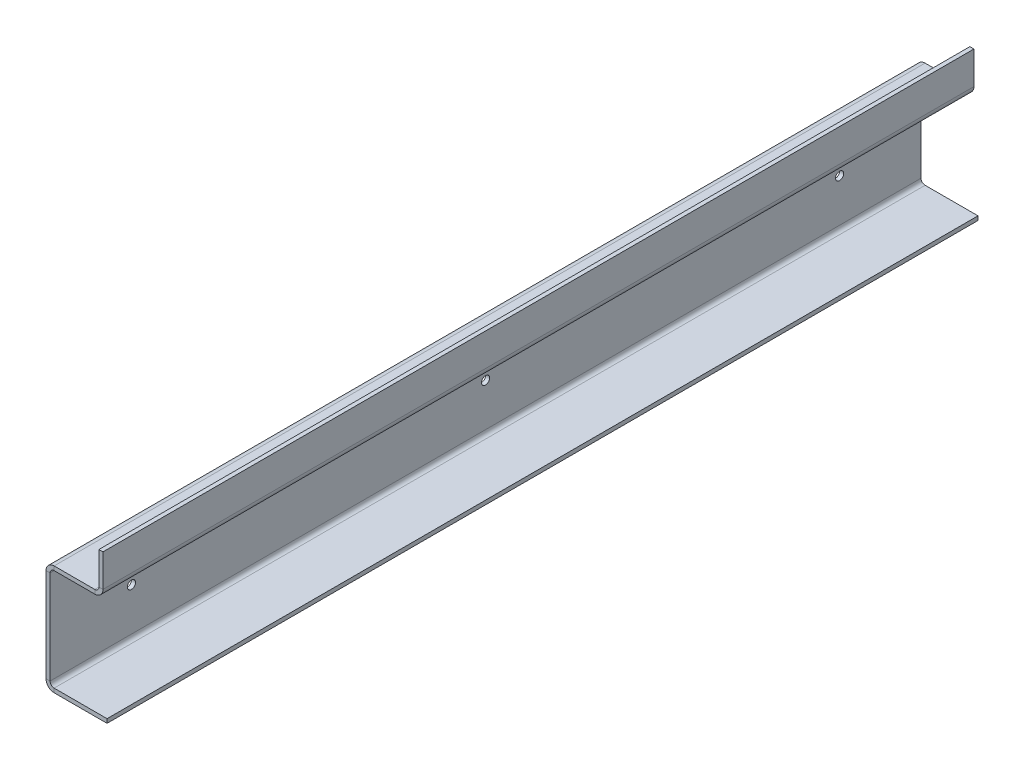
ISO-10303-21;
HEADER;
FILE_DESCRIPTION(('STEP AP214'),'2;1');
FILE_NAME('part.step','',(''),(''),'','','');
FILE_SCHEMA(('AUTOMOTIVE_DESIGN { 1 0 10303 214 1 1 1 1 }'));
ENDSEC;
DATA;
#1=APPLICATION_CONTEXT('core data for automotive mechanical design processes');
#2=APPLICATION_PROTOCOL_DEFINITION('international standard','automotive_design',2000,#1);
#3=PRODUCT_CONTEXT('',#1,'mechanical');
#4=PRODUCT('Part','Part','',(#3));
#5=PRODUCT_RELATED_PRODUCT_CATEGORY('part','',(#4));
#6=PRODUCT_DEFINITION_FORMATION('','',#4);
#7=PRODUCT_DEFINITION_CONTEXT('part definition',#1,'design');
#8=PRODUCT_DEFINITION('design','',#6,#7);
#9=PRODUCT_DEFINITION_SHAPE('','',#8);
#10=(LENGTH_UNIT() NAMED_UNIT(*) SI_UNIT(.MILLI.,.METRE.));
#11=(NAMED_UNIT(*) PLANE_ANGLE_UNIT() SI_UNIT($,.RADIAN.));
#12=(NAMED_UNIT(*) SI_UNIT($,.STERADIAN.) SOLID_ANGLE_UNIT());
#13=UNCERTAINTY_MEASURE_WITH_UNIT(LENGTH_MEASURE(1.E-05),#10,'distance_accuracy_value','');
#14=(GEOMETRIC_REPRESENTATION_CONTEXT(3) GLOBAL_UNCERTAINTY_ASSIGNED_CONTEXT((#13)) GLOBAL_UNIT_ASSIGNED_CONTEXT((#10,
#11,#12)) REPRESENTATION_CONTEXT('',''));
#15=CARTESIAN_POINT('',(0.,0.,0.));
#16=DIRECTION('',(0.,0.,1.));
#17=DIRECTION('',(1.,0.,0.));
#18=AXIS2_PLACEMENT_3D('',#15,#16,#17);
#19=CARTESIAN_POINT('',(-38.,25.,174.));
#20=DIRECTION('',(1.,0.,0.));
#21=DIRECTION('',(0.,0.,-1.));
#22=AXIS2_PLACEMENT_3D('',#19,#20,#21);
#23=CYLINDRICAL_SURFACE('',#22,2.);
#24=CARTESIAN_POINT('',(-28.,25.,174.));
#25=DIRECTION('',(1.,0.,0.));
#26=DIRECTION('',(0.,0.,-1.));
#27=AXIS2_PLACEMENT_3D('',#24,#25,#26);
#28=CIRCLE('',#27,2.);
#29=CARTESIAN_POINT('',(-28.,25.,172.));
#30=VERTEX_POINT('',#29);
#31=EDGE_CURVE('E89',#30,#30,#28,.T.);
#32=ORIENTED_EDGE('',*,*,#31,.T.);
#33=EDGE_LOOP('',(#32));
#34=FACE_BOUND('',#33,.T.);
#35=CARTESIAN_POINT('',(-30.,25.,174.));
#36=DIRECTION('',(1.,0.,0.));
#37=DIRECTION('',(0.,1.,0.));
#38=AXIS2_PLACEMENT_3D('',#35,#36,#37);
#39=CIRCLE('',#38,2.);
#40=CARTESIAN_POINT('',(-30.,27.,174.));
#41=VERTEX_POINT('',#40);
#42=EDGE_CURVE('E13',#41,#41,#39,.T.);
#43=ORIENTED_EDGE('',*,*,#42,.F.);
#44=EDGE_LOOP('',(#43));
#45=FACE_BOUND('',#44,.T.);
#46=ADVANCED_FACE('F82',(#34,#45),#23,.F.);
#47=CARTESIAN_POINT('',(-2.,54.0000000000001,214.));
#48=DIRECTION('',(0.,0.,-1.));
#49=DIRECTION('',(-1.,0.,0.));
#50=AXIS2_PLACEMENT_3D('',#47,#48,#49);
#51=PLANE('',#50);
#52=DIRECTION('',(0.,-1.,0.));
#53=VECTOR('',#52,1.);
#54=CARTESIAN_POINT('',(-5.99999999999999,54.0000000000001,214.));
#55=LINE('',#54,#53);
#56=CARTESIAN_POINT('',(-5.99999999999999,54.0000000000001,214.));
#57=VERTEX_POINT('',#56);
#58=CARTESIAN_POINT('',(-5.99999999999999,52.0000000000001,214.));
#59=VERTEX_POINT('',#58);
#60=EDGE_CURVE('E267',#57,#59,#55,.T.);
#61=ORIENTED_EDGE('',*,*,#60,.F.);
#62=DIRECTION('',(1.,0.,0.));
#63=VECTOR('',#62,1.);
#64=CARTESIAN_POINT('',(-2.08744646960528E-13,54.0000000000001,214.));
#65=LINE('',#64,#63);
#66=CARTESIAN_POINT('',(-26.,54.,214.));
#67=VERTEX_POINT('',#66);
#68=EDGE_CURVE('E275',#67,#57,#65,.T.);
#69=ORIENTED_EDGE('',*,*,#68,.F.);
#70=DIRECTION('',(0.,-1.,0.));
#71=VECTOR('',#70,1.);
#72=CARTESIAN_POINT('',(-26.,52.,214.));
#73=LINE('',#72,#71);
#74=CARTESIAN_POINT('',(-26.,52.,214.));
#75=VERTEX_POINT('',#74);
#76=EDGE_CURVE('E288',#75,#67,#73,.F.);
#77=ORIENTED_EDGE('',*,*,#76,.F.);
#78=DIRECTION('',(-1.,0.,0.));
#79=VECTOR('',#78,1.);
#80=CARTESIAN_POINT('',(-1.99999999999999,52.0000000000001,214.));
#81=LINE('',#80,#79);
#82=EDGE_CURVE('E281',#75,#59,#81,.F.);
#83=ORIENTED_EDGE('',*,*,#82,.T.);
#84=EDGE_LOOP('',(#61,#69,#77,#83));
#85=FACE_BOUND('',#84,.T.);
#86=ADVANCED_FACE('F413',(#85),#51,.F.);
#87=CARTESIAN_POINT('',(-28.,54.,-214.));
#88=DIRECTION('',(0.,0.,1.));
#89=DIRECTION('',(1.,0.,0.));
#90=AXIS2_PLACEMENT_3D('',#87,#88,#89);
#91=PLANE('',#90);
#92=DIRECTION('',(0.,-1.,0.));
#93=VECTOR('',#92,1.);
#94=CARTESIAN_POINT('',(-5.99999999999999,54.0000000000001,-214.));
#95=LINE('',#94,#93);
#96=CARTESIAN_POINT('',(-5.99999999999999,54.0000000000001,-214.));
#97=VERTEX_POINT('',#96);
#98=CARTESIAN_POINT('',(-5.99999999999999,52.0000000000001,-214.));
#99=VERTEX_POINT('',#98);
#100=EDGE_CURVE('E255',#97,#99,#95,.T.);
#101=ORIENTED_EDGE('',*,*,#100,.T.);
#102=DIRECTION('',(1.,0.,0.));
#103=VECTOR('',#102,1.);
#104=CARTESIAN_POINT('',(-28.,52.,-214.));
#105=LINE('',#104,#103);
#106=CARTESIAN_POINT('',(-26.,52.,-214.));
#107=VERTEX_POINT('',#106);
#108=EDGE_CURVE('E278',#99,#107,#105,.F.);
#109=ORIENTED_EDGE('',*,*,#108,.T.);
#110=DIRECTION('',(0.,-1.,0.));
#111=VECTOR('',#110,1.);
#112=CARTESIAN_POINT('',(-26.,54.,-214.));
#113=LINE('',#112,#111);
#114=CARTESIAN_POINT('',(-26.,54.,-214.));
#115=VERTEX_POINT('',#114);
#116=EDGE_CURVE('E269',#107,#115,#113,.F.);
#117=ORIENTED_EDGE('',*,*,#116,.T.);
#118=DIRECTION('',(-1.,0.,0.));
#119=VECTOR('',#118,1.);
#120=CARTESIAN_POINT('',(-2.08744646960528E-13,54.0000000000001,-214.));
#121=LINE('',#120,#119);
#122=EDGE_CURVE('E272',#97,#115,#121,.T.);
#123=ORIENTED_EDGE('',*,*,#122,.F.);
#124=EDGE_LOOP('',(#101,#109,#117,#123));
#125=FACE_BOUND('',#124,.T.);
#126=ADVANCED_FACE('F417',(#125),#91,.F.);
#127=CARTESIAN_POINT('',(-2.08744646960528E-13,54.0000000000001,0.));
#128=DIRECTION('',(0.,-1.,0.));
#129=DIRECTION('',(1.,0.,0.));
#130=AXIS2_PLACEMENT_3D('',#127,#128,#129);
#131=PLANE('',#130);
#132=DIRECTION('',(0.,0.,-1.));
#133=VECTOR('',#132,1.);
#134=CARTESIAN_POINT('',(-5.99999999999999,54.0000000000001,-214.));
#135=LINE('',#134,#133);
#136=EDGE_CURVE('E261',#97,#57,#135,.F.);
#137=ORIENTED_EDGE('',*,*,#136,.F.);
#138=ORIENTED_EDGE('',*,*,#122,.T.);
#139=DIRECTION('',(0.,0.,1.));
#140=VECTOR('',#139,1.);
#141=CARTESIAN_POINT('',(-26.,54.,-214.));
#142=LINE('',#141,#140);
#143=EDGE_CURVE('E284',#67,#115,#142,.F.);
#144=ORIENTED_EDGE('',*,*,#143,.F.);
#145=ORIENTED_EDGE('',*,*,#68,.T.);
#146=EDGE_LOOP('',(#137,#138,#144,#145));
#147=FACE_BOUND('',#146,.T.);
#148=ADVANCED_FACE('F423',(#147),#131,.F.);
#149=CARTESIAN_POINT('',(-2.01504688212326E-13,52.0000000000001,0.));
#150=DIRECTION('',(0.,-1.,0.));
#151=DIRECTION('',(1.,0.,0.));
#152=AXIS2_PLACEMENT_3D('',#149,#150,#151);
#153=PLANE('',#152);
#154=ORIENTED_EDGE('',*,*,#108,.F.);
#155=DIRECTION('',(0.,0.,-1.));
#156=VECTOR('',#155,1.);
#157=CARTESIAN_POINT('',(-5.99999999999999,52.0000000000001,-214.));
#158=LINE('',#157,#156);
#159=EDGE_CURVE('E248',#99,#59,#158,.F.);
#160=ORIENTED_EDGE('',*,*,#159,.T.);
#161=ORIENTED_EDGE('',*,*,#82,.F.);
#162=DIRECTION('',(0.,0.,1.));
#163=VECTOR('',#162,1.);
#164=CARTESIAN_POINT('',(-26.,52.,-214.));
#165=LINE('',#164,#163);
#166=EDGE_CURVE('E291',#107,#75,#165,.T.);
#167=ORIENTED_EDGE('',*,*,#166,.F.);
#168=EDGE_LOOP('',(#154,#160,#161,#167));
#169=FACE_BOUND('',#168,.T.);
#170=ADVANCED_FACE('F406',(#169),#153,.T.);
#171=CARTESIAN_POINT('',(-26.,2.,214.));
#172=DIRECTION('',(0.,0.,1.));
#173=DIRECTION('',(1.,0.,0.));
#174=AXIS2_PLACEMENT_3D('',#171,#172,#173);
#175=PLANE('',#174);
#176=DIRECTION('',(0.,-1.,0.));
#177=VECTOR('',#176,1.);
#178=CARTESIAN_POINT('',(-28.,54.,214.));
#179=LINE('',#178,#177);
#180=CARTESIAN_POINT('',(-28.,50.,214.));
#181=VERTEX_POINT('',#180);
#182=CARTESIAN_POINT('',(-28.,4.,214.));
#183=VERTEX_POINT('',#182);
#184=EDGE_CURVE('E333',#181,#183,#179,.T.);
#185=ORIENTED_EDGE('',*,*,#184,.F.);
#186=DIRECTION('',(-1.,0.,0.));
#187=VECTOR('',#186,1.);
#188=CARTESIAN_POINT('',(-28.,50.,214.));
#189=LINE('',#188,#187);
#190=CARTESIAN_POINT('',(-30.,50.,214.));
#191=VERTEX_POINT('',#190);
#192=EDGE_CURVE('E305',#181,#191,#189,.T.);
#193=ORIENTED_EDGE('',*,*,#192,.T.);
#194=DIRECTION('',(0.,-1.,0.));
#195=VECTOR('',#194,1.);
#196=CARTESIAN_POINT('',(-30.,54.,214.));
#197=LINE('',#196,#195);
#198=CARTESIAN_POINT('',(-30.,4.,214.));
#199=VERTEX_POINT('',#198);
#200=EDGE_CURVE('E335',#191,#199,#197,.T.);
#201=ORIENTED_EDGE('',*,*,#200,.T.);
#202=DIRECTION('',(1.,0.,0.));
#203=VECTOR('',#202,1.);
#204=CARTESIAN_POINT('',(-30.,4.,214.));
#205=LINE('',#204,#203);
#206=EDGE_CURVE('E383',#199,#183,#205,.T.);
#207=ORIENTED_EDGE('',*,*,#206,.T.);
#208=EDGE_LOOP('',(#185,#193,#201,#207));
#209=FACE_BOUND('',#208,.T.);
#210=ADVANCED_FACE('F396',(#209),#175,.T.);
#211=CARTESIAN_POINT('',(-28.,54.,214.));
#212=DIRECTION('',(1.,0.,0.));
#213=DIRECTION('',(0.,1.,0.));
#214=AXIS2_PLACEMENT_3D('',#211,#212,#213);
#215=PLANE('',#214);
#216=CARTESIAN_POINT('',(-28.,25.,0.));
#217=DIRECTION('',(1.,0.,0.));
#218=DIRECTION('',(0.,0.,-1.));
#219=AXIS2_PLACEMENT_3D('',#216,#217,#218);
#220=CIRCLE('',#219,2.);
#221=CARTESIAN_POINT('',(-28.,25.,-1.99999999999997));
#222=VERTEX_POINT('',#221);
#223=EDGE_CURVE('E528',#222,#222,#220,.T.);
#224=ORIENTED_EDGE('',*,*,#223,.F.);
#225=EDGE_LOOP('',(#224));
#226=FACE_BOUND('',#225,.T.);
#227=CARTESIAN_POINT('',(-28.,25.,-174.));
#228=DIRECTION('',(1.,0.,0.));
#229=DIRECTION('',(0.,0.,-1.));
#230=AXIS2_PLACEMENT_3D('',#227,#228,#229);
#231=CIRCLE('',#230,2.);
#232=CARTESIAN_POINT('',(-28.,25.,-176.));
#233=VERTEX_POINT('',#232);
#234=EDGE_CURVE('E387',#233,#233,#231,.T.);
#235=ORIENTED_EDGE('',*,*,#234,.F.);
#236=EDGE_LOOP('',(#235));
#237=FACE_BOUND('',#236,.T.);
#238=DIRECTION('',(0.,-1.,0.));
#239=VECTOR('',#238,1.);
#240=CARTESIAN_POINT('',(-28.,54.,-214.));
#241=LINE('',#240,#239);
#242=CARTESIAN_POINT('',(-28.,50.,-214.));
#243=VERTEX_POINT('',#242);
#244=CARTESIAN_POINT('',(-28.,4.,-214.));
#245=VERTEX_POINT('',#244);
#246=EDGE_CURVE('E353',#243,#245,#241,.T.);
#247=ORIENTED_EDGE('',*,*,#246,.F.);
#248=DIRECTION('',(0.,0.,1.));
#249=VECTOR('',#248,1.);
#250=CARTESIAN_POINT('',(-28.,50.,214.));
#251=LINE('',#250,#249);
#252=EDGE_CURVE('E104',#181,#243,#251,.F.);
#253=ORIENTED_EDGE('',*,*,#252,.F.);
#254=ORIENTED_EDGE('',*,*,#184,.T.);
#255=DIRECTION('',(0.,0.,-1.));
#256=VECTOR('',#255,1.);
#257=CARTESIAN_POINT('',(-28.,4.,214.));
#258=LINE('',#257,#256);
#259=EDGE_CURVE('E365',#183,#245,#258,.T.);
#260=ORIENTED_EDGE('',*,*,#259,.T.);
#261=EDGE_LOOP('',(#247,#253,#254,#260));
#262=FACE_BOUND('',#261,.T.);
#263=ORIENTED_EDGE('',*,*,#31,.F.);
#264=EDGE_LOOP('',(#263));
#265=FACE_BOUND('',#264,.T.);
#266=ADVANCED_FACE('F393',(#226,#237,#262,#265),#215,.T.);
#267=CARTESIAN_POINT('',(-30.,54.,214.));
#268=DIRECTION('',(1.,0.,0.));
#269=DIRECTION('',(0.,1.,0.));
#270=AXIS2_PLACEMENT_3D('',#267,#268,#269);
#271=PLANE('',#270);
#272=CARTESIAN_POINT('',(-30.,25.,0.));
#273=DIRECTION('',(1.,0.,0.));
#274=DIRECTION('',(0.,1.,0.));
#275=AXIS2_PLACEMENT_3D('',#272,#273,#274);
#276=CIRCLE('',#275,2.);
#277=CARTESIAN_POINT('',(-30.,27.,0.));
#278=VERTEX_POINT('',#277);
#279=EDGE_CURVE('E525',#278,#278,#276,.T.);
#280=ORIENTED_EDGE('',*,*,#279,.T.);
#281=EDGE_LOOP('',(#280));
#282=FACE_BOUND('',#281,.T.);
#283=CARTESIAN_POINT('',(-30.,25.,-174.));
#284=DIRECTION('',(1.,0.,0.));
#285=DIRECTION('',(0.,1.,0.));
#286=AXIS2_PLACEMENT_3D('',#283,#284,#285);
#287=CIRCLE('',#286,2.);
#288=CARTESIAN_POINT('',(-30.,27.,-174.));
#289=VERTEX_POINT('',#288);
#290=EDGE_CURVE('E247',#289,#289,#287,.T.);
#291=ORIENTED_EDGE('',*,*,#290,.T.);
#292=EDGE_LOOP('',(#291));
#293=FACE_BOUND('',#292,.T.);
#294=DIRECTION('',(0.,0.,1.));
#295=VECTOR('',#294,1.);
#296=CARTESIAN_POINT('',(-30.,50.,214.));
#297=LINE('',#296,#295);
#298=CARTESIAN_POINT('',(-30.,50.,-214.));
#299=VERTEX_POINT('',#298);
#300=EDGE_CURVE('E296',#191,#299,#297,.F.);
#301=ORIENTED_EDGE('',*,*,#300,.T.);
#302=DIRECTION('',(0.,-1.,0.));
#303=VECTOR('',#302,1.);
#304=CARTESIAN_POINT('',(-30.,54.,-214.));
#305=LINE('',#304,#303);
#306=CARTESIAN_POINT('',(-30.,4.,-214.));
#307=VERTEX_POINT('',#306);
#308=EDGE_CURVE('E356',#299,#307,#305,.T.);
#309=ORIENTED_EDGE('',*,*,#308,.T.);
#310=DIRECTION('',(0.,0.,-1.));
#311=VECTOR('',#310,1.);
#312=CARTESIAN_POINT('',(-30.,4.,214.));
#313=LINE('',#312,#311);
#314=EDGE_CURVE('E362',#199,#307,#313,.T.);
#315=ORIENTED_EDGE('',*,*,#314,.F.);
#316=ORIENTED_EDGE('',*,*,#200,.F.);
#317=EDGE_LOOP('',(#301,#309,#315,#316));
#318=FACE_BOUND('',#317,.T.);
#319=ORIENTED_EDGE('',*,*,#42,.T.);
#320=EDGE_LOOP('',(#319));
#321=FACE_BOUND('',#320,.T.);
#322=ADVANCED_FACE('F395',(#282,#293,#318,#321),#271,.F.);
#323=CARTESIAN_POINT('',(-26.,4.,-214.));
#324=DIRECTION('',(0.,0.,1.));
#325=DIRECTION('',(1.,0.,0.));
#326=AXIS2_PLACEMENT_3D('',#323,#324,#325);
#327=PLANE('',#326);
#328=DIRECTION('',(-1.,0.,0.));
#329=VECTOR('',#328,1.);
#330=CARTESIAN_POINT('',(-28.,50.,-214.));
#331=LINE('',#330,#329);
#332=EDGE_CURVE('E315',#243,#299,#331,.T.);
#333=ORIENTED_EDGE('',*,*,#332,.F.);
#334=ORIENTED_EDGE('',*,*,#246,.T.);
#335=DIRECTION('',(-1.,0.,0.));
#336=VECTOR('',#335,1.);
#337=CARTESIAN_POINT('',(-28.,4.,-214.));
#338=LINE('',#337,#336);
#339=EDGE_CURVE('E376',#245,#307,#338,.T.);
#340=ORIENTED_EDGE('',*,*,#339,.T.);
#341=ORIENTED_EDGE('',*,*,#308,.F.);
#342=EDGE_LOOP('',(#333,#334,#340,#341));
#343=FACE_BOUND('',#342,.T.);
#344=ADVANCED_FACE('F403',(#343),#327,.F.);
#345=CARTESIAN_POINT('',(-30.,4.,214.));
#346=DIRECTION('',(0.,0.,1.));
#347=DIRECTION('',(1.,0.,0.));
#348=AXIS2_PLACEMENT_3D('',#345,#346,#347);
#349=PLANE('',#348);
#350=ORIENTED_EDGE('',*,*,#206,.F.);
#351=CARTESIAN_POINT('',(-26.,4.,214.));
#352=DIRECTION('',(0.,0.,-1.));
#353=DIRECTION('',(-1.,0.,0.));
#354=AXIS2_PLACEMENT_3D('',#351,#352,#353);
#355=CIRCLE('',#354,4.);
#356=CARTESIAN_POINT('',(-26.,0.,214.));
#357=VERTEX_POINT('',#356);
#358=EDGE_CURVE('E337',#199,#357,#355,.F.);
#359=ORIENTED_EDGE('',*,*,#358,.T.);
#360=DIRECTION('',(0.,-1.,0.));
#361=VECTOR('',#360,1.);
#362=CARTESIAN_POINT('',(-26.,2.,214.));
#363=LINE('',#362,#361);
#364=CARTESIAN_POINT('',(-26.,2.,214.));
#365=VERTEX_POINT('',#364);
#366=EDGE_CURVE('E381',#365,#357,#363,.T.);
#367=ORIENTED_EDGE('',*,*,#366,.F.);
#368=CARTESIAN_POINT('',(-26.,4.,214.));
#369=DIRECTION('',(0.,0.,1.));
#370=DIRECTION('',(1.,0.,0.));
#371=AXIS2_PLACEMENT_3D('',#368,#369,#370);
#372=CIRCLE('',#371,2.);
#373=EDGE_CURVE('E330',#183,#365,#372,.T.);
#374=ORIENTED_EDGE('',*,*,#373,.F.);
#375=EDGE_LOOP('',(#350,#359,#367,#374));
#376=FACE_BOUND('',#375,.T.);
#377=ADVANCED_FACE('F453',(#376),#349,.T.);
#378=CARTESIAN_POINT('',(-26.,0.,-214.));
#379=DIRECTION('',(0.,0.,-1.));
#380=DIRECTION('',(-1.,0.,0.));
#381=AXIS2_PLACEMENT_3D('',#378,#379,#380);
#382=PLANE('',#381);
#383=DIRECTION('',(0.,1.,0.));
#384=VECTOR('',#383,1.);
#385=CARTESIAN_POINT('',(-26.,0.,-214.));
#386=LINE('',#385,#384);
#387=CARTESIAN_POINT('',(-26.,0.,-214.));
#388=VERTEX_POINT('',#387);
#389=CARTESIAN_POINT('',(-26.,2.,-214.));
#390=VERTEX_POINT('',#389);
#391=EDGE_CURVE('E379',#388,#390,#386,.T.);
#392=ORIENTED_EDGE('',*,*,#391,.F.);
#393=CARTESIAN_POINT('',(-26.,4.,-214.));
#394=DIRECTION('',(0.,0.,-1.));
#395=DIRECTION('',(-1.,0.,0.));
#396=AXIS2_PLACEMENT_3D('',#393,#394,#395);
#397=CIRCLE('',#396,4.);
#398=EDGE_CURVE('E324',#307,#388,#397,.F.);
#399=ORIENTED_EDGE('',*,*,#398,.F.);
#400=ORIENTED_EDGE('',*,*,#339,.F.);
#401=CARTESIAN_POINT('',(-26.,4.,-214.));
#402=DIRECTION('',(0.,0.,1.));
#403=DIRECTION('',(1.,0.,0.));
#404=AXIS2_PLACEMENT_3D('',#401,#402,#403);
#405=CIRCLE('',#404,2.);
#406=EDGE_CURVE('E350',#245,#390,#405,.T.);
#407=ORIENTED_EDGE('',*,*,#406,.T.);
#408=EDGE_LOOP('',(#392,#399,#400,#407));
#409=FACE_BOUND('',#408,.T.);
#410=ADVANCED_FACE('F492',(#409),#382,.T.);
#411=CARTESIAN_POINT('',(-28.,4.,-214.));
#412=DIRECTION('',(0.,0.,-1.));
#413=DIRECTION('',(-1.,0.,0.));
#414=AXIS2_PLACEMENT_3D('',#411,#412,#413);
#415=PLANE('',#414);
#416=DIRECTION('',(1.,0.,0.));
#417=VECTOR('',#416,1.);
#418=CARTESIAN_POINT('',(-30.,0.,-214.));
#419=LINE('',#418,#417);
#420=CARTESIAN_POINT('',(0.,0.,-214.));
#421=VERTEX_POINT('',#420);
#422=EDGE_CURVE('E318',#388,#421,#419,.T.);
#423=ORIENTED_EDGE('',*,*,#422,.F.);
#424=ORIENTED_EDGE('',*,*,#391,.T.);
#425=DIRECTION('',(1.,0.,0.));
#426=VECTOR('',#425,1.);
#427=CARTESIAN_POINT('',(-30.,2.,-214.));
#428=LINE('',#427,#426);
#429=CARTESIAN_POINT('',(0.,2.,-214.));
#430=VERTEX_POINT('',#429);
#431=EDGE_CURVE('E347',#390,#430,#428,.T.);
#432=ORIENTED_EDGE('',*,*,#431,.T.);
#433=DIRECTION('',(0.,-1.,0.));
#434=VECTOR('',#433,1.);
#435=CARTESIAN_POINT('',(0.,2.,-214.));
#436=LINE('',#435,#434);
#437=EDGE_CURVE('E344',#430,#421,#436,.T.);
#438=ORIENTED_EDGE('',*,*,#437,.T.);
#439=EDGE_LOOP('',(#423,#424,#432,#438));
#440=FACE_BOUND('',#439,.T.);
#441=ADVANCED_FACE('F475',(#440),#415,.T.);
#442=CARTESIAN_POINT('',(-30.,0.,214.));
#443=DIRECTION('',(0.,1.,0.));
#444=DIRECTION('',(0.,0.,1.));
#445=AXIS2_PLACEMENT_3D('',#442,#443,#444);
#446=PLANE('',#445);
#447=ORIENTED_EDGE('',*,*,#422,.T.);
#448=DIRECTION('',(0.,0.,-1.));
#449=VECTOR('',#448,1.);
#450=CARTESIAN_POINT('',(0.,0.,214.));
#451=LINE('',#450,#449);
#452=CARTESIAN_POINT('',(0.,0.,214.));
#453=VERTEX_POINT('',#452);
#454=EDGE_CURVE('E373',#453,#421,#451,.T.);
#455=ORIENTED_EDGE('',*,*,#454,.F.);
#456=DIRECTION('',(1.,0.,0.));
#457=VECTOR('',#456,1.);
#458=CARTESIAN_POINT('',(-30.,0.,214.));
#459=LINE('',#458,#457);
#460=EDGE_CURVE('E321',#357,#453,#459,.T.);
#461=ORIENTED_EDGE('',*,*,#460,.F.);
#462=DIRECTION('',(0.,0.,-1.));
#463=VECTOR('',#462,1.);
#464=CARTESIAN_POINT('',(-26.,0.,214.));
#465=LINE('',#464,#463);
#466=EDGE_CURVE('E340',#357,#388,#465,.T.);
#467=ORIENTED_EDGE('',*,*,#466,.T.);
#468=EDGE_LOOP('',(#447,#455,#461,#467));
#469=FACE_BOUND('',#468,.T.);
#470=ADVANCED_FACE('F472',(#469),#446,.F.);
#471=CARTESIAN_POINT('',(0.,2.,214.));
#472=DIRECTION('',(1.,0.,0.));
#473=DIRECTION('',(0.,0.,-1.));
#474=AXIS2_PLACEMENT_3D('',#471,#472,#473);
#475=PLANE('',#474);
#476=ORIENTED_EDGE('',*,*,#437,.F.);
#477=DIRECTION('',(0.,0.,-1.));
#478=VECTOR('',#477,1.);
#479=CARTESIAN_POINT('',(0.,2.,214.));
#480=LINE('',#479,#478);
#481=CARTESIAN_POINT('',(0.,2.,214.));
#482=VERTEX_POINT('',#481);
#483=EDGE_CURVE('E371',#482,#430,#480,.T.);
#484=ORIENTED_EDGE('',*,*,#483,.F.);
#485=DIRECTION('',(0.,-1.,0.));
#486=VECTOR('',#485,1.);
#487=CARTESIAN_POINT('',(0.,2.,214.));
#488=LINE('',#487,#486);
#489=EDGE_CURVE('E323',#482,#453,#488,.T.);
#490=ORIENTED_EDGE('',*,*,#489,.T.);
#491=ORIENTED_EDGE('',*,*,#454,.T.);
#492=EDGE_LOOP('',(#476,#484,#490,#491));
#493=FACE_BOUND('',#492,.T.);
#494=ADVANCED_FACE('F479',(#493),#475,.T.);
#495=CARTESIAN_POINT('',(-30.,2.,214.));
#496=DIRECTION('',(0.,1.,0.));
#497=DIRECTION('',(0.,0.,1.));
#498=AXIS2_PLACEMENT_3D('',#495,#496,#497);
#499=PLANE('',#498);
#500=ORIENTED_EDGE('',*,*,#431,.F.);
#501=DIRECTION('',(0.,0.,-1.));
#502=VECTOR('',#501,1.);
#503=CARTESIAN_POINT('',(-26.,2.,214.));
#504=LINE('',#503,#502);
#505=EDGE_CURVE('E368',#365,#390,#504,.T.);
#506=ORIENTED_EDGE('',*,*,#505,.F.);
#507=DIRECTION('',(1.,0.,0.));
#508=VECTOR('',#507,1.);
#509=CARTESIAN_POINT('',(-30.,2.,214.));
#510=LINE('',#509,#508);
#511=EDGE_CURVE('E327',#365,#482,#510,.T.);
#512=ORIENTED_EDGE('',*,*,#511,.T.);
#513=ORIENTED_EDGE('',*,*,#483,.T.);
#514=EDGE_LOOP('',(#500,#506,#512,#513));
#515=FACE_BOUND('',#514,.T.);
#516=ADVANCED_FACE('F461',(#515),#499,.T.);
#517=CARTESIAN_POINT('',(-26.,4.,214.));
#518=DIRECTION('',(0.,0.,-1.));
#519=DIRECTION('',(-1.,0.,0.));
#520=AXIS2_PLACEMENT_3D('',#517,#518,#519);
#521=CYLINDRICAL_SURFACE('',#520,2.);
#522=ORIENTED_EDGE('',*,*,#406,.F.);
#523=ORIENTED_EDGE('',*,*,#259,.F.);
#524=ORIENTED_EDGE('',*,*,#373,.T.);
#525=ORIENTED_EDGE('',*,*,#505,.T.);
#526=EDGE_LOOP('',(#522,#523,#524,#525));
#527=FACE_BOUND('',#526,.T.);
#528=ADVANCED_FACE('F456',(#527),#521,.F.);
#529=CARTESIAN_POINT('',(-26.,4.,214.));
#530=DIRECTION('',(0.,0.,-1.));
#531=DIRECTION('',(-1.,0.,0.));
#532=AXIS2_PLACEMENT_3D('',#529,#530,#531);
#533=CYLINDRICAL_SURFACE('',#532,4.);
#534=ORIENTED_EDGE('',*,*,#398,.T.);
#535=ORIENTED_EDGE('',*,*,#466,.F.);
#536=ORIENTED_EDGE('',*,*,#358,.F.);
#537=ORIENTED_EDGE('',*,*,#314,.T.);
#538=EDGE_LOOP('',(#534,#535,#536,#537));
#539=FACE_BOUND('',#538,.T.);
#540=ADVANCED_FACE('F449',(#539),#533,.T.);
#541=CARTESIAN_POINT('',(-26.,4.,214.));
#542=DIRECTION('',(0.,0.,1.));
#543=DIRECTION('',(1.,0.,0.));
#544=AXIS2_PLACEMENT_3D('',#541,#542,#543);
#545=PLANE('',#544);
#546=ORIENTED_EDGE('',*,*,#460,.T.);
#547=ORIENTED_EDGE('',*,*,#489,.F.);
#548=ORIENTED_EDGE('',*,*,#511,.F.);
#549=ORIENTED_EDGE('',*,*,#366,.T.);
#550=EDGE_LOOP('',(#546,#547,#548,#549));
#551=FACE_BOUND('',#550,.T.);
#552=ADVANCED_FACE('F442',(#551),#545,.T.);
#553=CARTESIAN_POINT('',(-26.,50.,-214.));
#554=DIRECTION('',(0.,0.,-1.));
#555=DIRECTION('',(-1.,0.,0.));
#556=AXIS2_PLACEMENT_3D('',#553,#554,#555);
#557=PLANE('',#556);
#558=ORIENTED_EDGE('',*,*,#116,.F.);
#559=CARTESIAN_POINT('',(-26.,50.,-214.));
#560=DIRECTION('',(0.,0.,1.));
#561=DIRECTION('',(1.,0.,0.));
#562=AXIS2_PLACEMENT_3D('',#559,#560,#561);
#563=CIRCLE('',#562,2.);
#564=EDGE_CURVE('E308',#243,#107,#563,.F.);
#565=ORIENTED_EDGE('',*,*,#564,.F.);
#566=ORIENTED_EDGE('',*,*,#332,.T.);
#567=CARTESIAN_POINT('',(-26.,50.,-214.));
#568=DIRECTION('',(0.,0.,1.));
#569=DIRECTION('',(1.,0.,0.));
#570=AXIS2_PLACEMENT_3D('',#567,#568,#569);
#571=CIRCLE('',#570,4.);
#572=EDGE_CURVE('E300',#299,#115,#571,.F.);
#573=ORIENTED_EDGE('',*,*,#572,.T.);
#574=EDGE_LOOP('',(#558,#565,#566,#573));
#575=FACE_BOUND('',#574,.T.);
#576=ADVANCED_FACE('F439',(#575),#557,.T.);
#577=CARTESIAN_POINT('',(-26.,50.,214.));
#578=DIRECTION('',(0.,0.,-1.));
#579=DIRECTION('',(-1.,0.,0.));
#580=AXIS2_PLACEMENT_3D('',#577,#578,#579);
#581=PLANE('',#580);
#582=CARTESIAN_POINT('',(-26.,50.,214.));
#583=DIRECTION('',(0.,0.,1.));
#584=DIRECTION('',(1.,0.,0.));
#585=AXIS2_PLACEMENT_3D('',#582,#583,#584);
#586=CIRCLE('',#585,2.);
#587=EDGE_CURVE('E274',#75,#181,#586,.T.);
#588=ORIENTED_EDGE('',*,*,#587,.F.);
#589=ORIENTED_EDGE('',*,*,#76,.T.);
#590=CARTESIAN_POINT('',(-26.,50.,214.));
#591=DIRECTION('',(0.,0.,1.));
#592=DIRECTION('',(1.,0.,0.));
#593=AXIS2_PLACEMENT_3D('',#590,#591,#592);
#594=CIRCLE('',#593,4.);
#595=EDGE_CURVE('E301',#67,#191,#594,.T.);
#596=ORIENTED_EDGE('',*,*,#595,.T.);
#597=ORIENTED_EDGE('',*,*,#192,.F.);
#598=EDGE_LOOP('',(#588,#589,#596,#597));
#599=FACE_BOUND('',#598,.T.);
#600=ADVANCED_FACE('F433',(#599),#581,.F.);
#601=CARTESIAN_POINT('',(-26.,50.,214.));
#602=DIRECTION('',(0.,0.,1.));
#603=DIRECTION('',(0.,1.,0.));
#604=AXIS2_PLACEMENT_3D('',#601,#602,#603);
#605=CYLINDRICAL_SURFACE('',#604,4.);
#606=ORIENTED_EDGE('',*,*,#300,.F.);
#607=ORIENTED_EDGE('',*,*,#595,.F.);
#608=ORIENTED_EDGE('',*,*,#143,.T.);
#609=ORIENTED_EDGE('',*,*,#572,.F.);
#610=EDGE_LOOP('',(#606,#607,#608,#609));
#611=FACE_BOUND('',#610,.T.);
#612=ADVANCED_FACE('F429',(#611),#605,.T.);
#613=CARTESIAN_POINT('',(-26.,50.,214.));
#614=DIRECTION('',(0.,0.,1.));
#615=DIRECTION('',(0.,1.,0.));
#616=AXIS2_PLACEMENT_3D('',#613,#614,#615);
#617=CYLINDRICAL_SURFACE('',#616,2.);
#618=ORIENTED_EDGE('',*,*,#252,.T.);
#619=ORIENTED_EDGE('',*,*,#564,.T.);
#620=ORIENTED_EDGE('',*,*,#166,.T.);
#621=ORIENTED_EDGE('',*,*,#587,.T.);
#622=EDGE_LOOP('',(#618,#619,#620,#621));
#623=FACE_BOUND('',#622,.T.);
#624=ADVANCED_FACE('F432',(#623),#617,.F.);
#625=CARTESIAN_POINT('',(-6.,56.0000000000001,214.));
#626=DIRECTION('',(0.,0.,1.));
#627=DIRECTION('',(1.,0.,0.));
#628=AXIS2_PLACEMENT_3D('',#625,#626,#627);
#629=PLANE('',#628);
#630=DIRECTION('',(-1.,0.,0.));
#631=VECTOR('',#630,1.);
#632=CARTESIAN_POINT('',(-2.,56.0000000000001,214.));
#633=LINE('',#632,#631);
#634=CARTESIAN_POINT('',(-4.,56.0000000000001,214.));
#635=VERTEX_POINT('',#634);
#636=CARTESIAN_POINT('',(-2.,56.0000000000001,214.));
#637=VERTEX_POINT('',#636);
#638=EDGE_CURVE('E220',#635,#637,#633,.F.);
#639=ORIENTED_EDGE('',*,*,#638,.F.);
#640=CARTESIAN_POINT('',(-6.,56.0000000000001,214.));
#641=DIRECTION('',(0.,0.,-1.));
#642=DIRECTION('',(-1.,0.,0.));
#643=AXIS2_PLACEMENT_3D('',#640,#641,#642);
#644=CIRCLE('',#643,2.);
#645=EDGE_CURVE('E258',#57,#635,#644,.F.);
#646=ORIENTED_EDGE('',*,*,#645,.F.);
#647=ORIENTED_EDGE('',*,*,#60,.T.);
#648=CARTESIAN_POINT('',(-6.,56.0000000000001,214.));
#649=DIRECTION('',(0.,0.,-1.));
#650=DIRECTION('',(-1.,0.,0.));
#651=AXIS2_PLACEMENT_3D('',#648,#649,#650);
#652=CIRCLE('',#651,4.);
#653=EDGE_CURVE('E96',#59,#637,#652,.F.);
#654=ORIENTED_EDGE('',*,*,#653,.T.);
#655=EDGE_LOOP('',(#639,#646,#647,#654));
#656=FACE_BOUND('',#655,.T.);
#657=ADVANCED_FACE('F437',(#656),#629,.T.);
#658=CARTESIAN_POINT('',(-6.,56.0000000000001,-214.));
#659=DIRECTION('',(0.,0.,1.));
#660=DIRECTION('',(1.,0.,0.));
#661=AXIS2_PLACEMENT_3D('',#658,#659,#660);
#662=PLANE('',#661);
#663=CARTESIAN_POINT('',(-6.,56.0000000000001,-214.));
#664=DIRECTION('',(0.,0.,-1.));
#665=DIRECTION('',(-1.,0.,0.));
#666=AXIS2_PLACEMENT_3D('',#663,#664,#665);
#667=CIRCLE('',#666,2.);
#668=CARTESIAN_POINT('',(-4.,56.0000000000001,-214.));
#669=VERTEX_POINT('',#668);
#670=EDGE_CURVE('E264',#669,#97,#667,.T.);
#671=ORIENTED_EDGE('',*,*,#670,.F.);
#672=DIRECTION('',(-1.,0.,0.));
#673=VECTOR('',#672,1.);
#674=CARTESIAN_POINT('',(-4.,56.0000000000001,-214.));
#675=LINE('',#674,#673);
#676=CARTESIAN_POINT('',(-2.,56.0000000000001,-214.));
#677=VERTEX_POINT('',#676);
#678=EDGE_CURVE('E240',#669,#677,#675,.F.);
#679=ORIENTED_EDGE('',*,*,#678,.T.);
#680=CARTESIAN_POINT('',(-6.,56.0000000000001,-214.));
#681=DIRECTION('',(0.,0.,-1.));
#682=DIRECTION('',(-1.,0.,0.));
#683=AXIS2_PLACEMENT_3D('',#680,#681,#682);
#684=CIRCLE('',#683,4.);
#685=EDGE_CURVE('E252',#677,#99,#684,.T.);
#686=ORIENTED_EDGE('',*,*,#685,.T.);
#687=ORIENTED_EDGE('',*,*,#100,.F.);
#688=EDGE_LOOP('',(#671,#679,#686,#687));
#689=FACE_BOUND('',#688,.T.);
#690=ADVANCED_FACE('F510',(#689),#662,.F.);
#691=CARTESIAN_POINT('',(-6.,56.0000000000001,-214.));
#692=DIRECTION('',(0.,0.,-1.));
#693=DIRECTION('',(1.,0.,0.));
#694=AXIS2_PLACEMENT_3D('',#691,#692,#693);
#695=CYLINDRICAL_SURFACE('',#694,4.);
#696=ORIENTED_EDGE('',*,*,#159,.F.);
#697=ORIENTED_EDGE('',*,*,#685,.F.);
#698=DIRECTION('',(0.,0.,-1.));
#699=VECTOR('',#698,1.);
#700=CARTESIAN_POINT('',(-2.,56.0000000000001,214.));
#701=LINE('',#700,#699);
#702=EDGE_CURVE('E237',#677,#637,#701,.F.);
#703=ORIENTED_EDGE('',*,*,#702,.T.);
#704=ORIENTED_EDGE('',*,*,#653,.F.);
#705=EDGE_LOOP('',(#696,#697,#703,#704));
#706=FACE_BOUND('',#705,.T.);
#707=ADVANCED_FACE('F556',(#706),#695,.T.);
#708=CARTESIAN_POINT('',(-6.,56.0000000000001,-214.));
#709=DIRECTION('',(0.,0.,-1.));
#710=DIRECTION('',(1.,0.,0.));
#711=AXIS2_PLACEMENT_3D('',#708,#709,#710);
#712=CYLINDRICAL_SURFACE('',#711,2.);
#713=ORIENTED_EDGE('',*,*,#136,.T.);
#714=ORIENTED_EDGE('',*,*,#645,.T.);
#715=DIRECTION('',(0.,0.,-1.));
#716=VECTOR('',#715,1.);
#717=CARTESIAN_POINT('',(-4.,56.0000000000001,214.));
#718=LINE('',#717,#716);
#719=EDGE_CURVE('E243',#635,#669,#718,.T.);
#720=ORIENTED_EDGE('',*,*,#719,.T.);
#721=ORIENTED_EDGE('',*,*,#670,.T.);
#722=EDGE_LOOP('',(#713,#714,#720,#721));
#723=FACE_BOUND('',#722,.T.);
#724=ADVANCED_FACE('F513',(#723),#712,.F.);
#725=CARTESIAN_POINT('',(-2.,54.0000000000001,214.));
#726=DIRECTION('',(0.,0.,-1.));
#727=DIRECTION('',(-1.,0.,0.));
#728=AXIS2_PLACEMENT_3D('',#725,#726,#727);
#729=PLANE('',#728);
#730=ORIENTED_EDGE('',*,*,#638,.T.);
#731=DIRECTION('',(0.,-1.,0.));
#732=VECTOR('',#731,1.);
#733=CARTESIAN_POINT('',(-1.99999999999999,0.,214.));
#734=LINE('',#733,#732);
#735=CARTESIAN_POINT('',(-2.00000000000001,72.0000000000001,214.));
#736=VERTEX_POINT('',#735);
#737=EDGE_CURVE('E200',#736,#637,#734,.T.);
#738=ORIENTED_EDGE('',*,*,#737,.F.);
#739=DIRECTION('',(-1.,0.,0.));
#740=VECTOR('',#739,1.);
#741=CARTESIAN_POINT('',(-2.00000000000001,72.0000000000001,214.));
#742=LINE('',#741,#740);
#743=CARTESIAN_POINT('',(-4.00000000000001,72.0000000000001,214.));
#744=VERTEX_POINT('',#743);
#745=EDGE_CURVE('E207',#736,#744,#742,.T.);
#746=ORIENTED_EDGE('',*,*,#745,.T.);
#747=DIRECTION('',(0.,1.,0.));
#748=VECTOR('',#747,1.);
#749=CARTESIAN_POINT('',(-4.,54.0000000000001,214.));
#750=LINE('',#749,#748);
#751=EDGE_CURVE('E234',#744,#635,#750,.F.);
#752=ORIENTED_EDGE('',*,*,#751,.T.);
#753=EDGE_LOOP('',(#730,#738,#746,#752));
#754=FACE_BOUND('',#753,.T.);
#755=ADVANCED_FACE('F219',(#754),#729,.F.);
#756=CARTESIAN_POINT('',(-2.00000000000001,72.0000000000001,-214.));
#757=DIRECTION('',(0.,0.,1.));
#758=DIRECTION('',(1.,0.,0.));
#759=AXIS2_PLACEMENT_3D('',#756,#757,#758);
#760=PLANE('',#759);
#761=ORIENTED_EDGE('',*,*,#678,.F.);
#762=DIRECTION('',(0.,-1.,0.));
#763=VECTOR('',#762,1.);
#764=CARTESIAN_POINT('',(-4.00000000000001,72.0000000000001,-214.));
#765=LINE('',#764,#763);
#766=CARTESIAN_POINT('',(-4.00000000000001,72.0000000000001,-214.));
#767=VERTEX_POINT('',#766);
#768=EDGE_CURVE('E229',#669,#767,#765,.F.);
#769=ORIENTED_EDGE('',*,*,#768,.T.);
#770=DIRECTION('',(-1.,0.,0.));
#771=VECTOR('',#770,1.);
#772=CARTESIAN_POINT('',(-2.00000000000001,72.0000000000001,-214.));
#773=LINE('',#772,#771);
#774=CARTESIAN_POINT('',(-2.00000000000001,72.0000000000001,-214.));
#775=VERTEX_POINT('',#774);
#776=EDGE_CURVE('E216',#775,#767,#773,.T.);
#777=ORIENTED_EDGE('',*,*,#776,.F.);
#778=DIRECTION('',(0.,1.,0.));
#779=VECTOR('',#778,1.);
#780=CARTESIAN_POINT('',(-1.99999999999999,0.,-214.));
#781=LINE('',#780,#779);
#782=EDGE_CURVE('E202',#677,#775,#781,.T.);
#783=ORIENTED_EDGE('',*,*,#782,.F.);
#784=EDGE_LOOP('',(#761,#769,#777,#783));
#785=FACE_BOUND('',#784,.T.);
#786=ADVANCED_FACE('F520',(#785),#760,.F.);
#787=CARTESIAN_POINT('',(-1.99999999999999,0.,0.));
#788=DIRECTION('',(-1.,0.,0.));
#789=DIRECTION('',(0.,-1.,0.));
#790=AXIS2_PLACEMENT_3D('',#787,#788,#789);
#791=PLANE('',#790);
#792=ORIENTED_EDGE('',*,*,#702,.F.);
#793=ORIENTED_EDGE('',*,*,#782,.T.);
#794=DIRECTION('',(0.,0.,1.));
#795=VECTOR('',#794,1.);
#796=CARTESIAN_POINT('',(-2.00000000000001,72.0000000000001,0.));
#797=LINE('',#796,#795);
#798=EDGE_CURVE('E195',#775,#736,#797,.T.);
#799=ORIENTED_EDGE('',*,*,#798,.T.);
#800=ORIENTED_EDGE('',*,*,#737,.T.);
#801=EDGE_LOOP('',(#792,#793,#799,#800));
#802=FACE_BOUND('',#801,.T.);
#803=ADVANCED_FACE('F198',(#802),#791,.F.);
#804=CARTESIAN_POINT('',(-3.99999999999999,0.,0.));
#805=DIRECTION('',(-1.,0.,0.));
#806=DIRECTION('',(0.,-1.,0.));
#807=AXIS2_PLACEMENT_3D('',#804,#805,#806);
#808=PLANE('',#807);
#809=ORIENTED_EDGE('',*,*,#768,.F.);
#810=ORIENTED_EDGE('',*,*,#719,.F.);
#811=ORIENTED_EDGE('',*,*,#751,.F.);
#812=DIRECTION('',(0.,0.,-1.));
#813=VECTOR('',#812,1.);
#814=CARTESIAN_POINT('',(-4.00000000000001,72.0000000000001,214.));
#815=LINE('',#814,#813);
#816=EDGE_CURVE('E212',#767,#744,#815,.F.);
#817=ORIENTED_EDGE('',*,*,#816,.F.);
#818=EDGE_LOOP('',(#809,#810,#811,#817));
#819=FACE_BOUND('',#818,.T.);
#820=ADVANCED_FACE('F518',(#819),#808,.T.);
#821=CARTESIAN_POINT('',(-2.00000000000001,72.0000000000001,214.));
#822=DIRECTION('',(0.,-1.,0.));
#823=DIRECTION('',(1.,0.,0.));
#824=AXIS2_PLACEMENT_3D('',#821,#822,#823);
#825=PLANE('',#824);
#826=ORIENTED_EDGE('',*,*,#816,.T.);
#827=ORIENTED_EDGE('',*,*,#745,.F.);
#828=ORIENTED_EDGE('',*,*,#798,.F.);
#829=ORIENTED_EDGE('',*,*,#776,.T.);
#830=EDGE_LOOP('',(#826,#827,#828,#829));
#831=FACE_BOUND('',#830,.T.);
#832=ADVANCED_FACE('F210',(#831),#825,.F.);
#833=CARTESIAN_POINT('',(-38.,25.,-174.));
#834=DIRECTION('',(1.,0.,0.));
#835=DIRECTION('',(0.,0.,-1.));
#836=AXIS2_PLACEMENT_3D('',#833,#834,#835);
#837=CYLINDRICAL_SURFACE('',#836,2.);
#838=ORIENTED_EDGE('',*,*,#234,.T.);
#839=EDGE_LOOP('',(#838));
#840=FACE_BOUND('',#839,.T.);
#841=ORIENTED_EDGE('',*,*,#290,.F.);
#842=EDGE_LOOP('',(#841));
#843=FACE_BOUND('',#842,.T.);
#844=ADVANCED_FACE('F534',(#840,#843),#837,.F.);
#845=CARTESIAN_POINT('',(-38.,25.,0.));
#846=DIRECTION('',(1.,0.,0.));
#847=DIRECTION('',(0.,0.,-1.));
#848=AXIS2_PLACEMENT_3D('',#845,#846,#847);
#849=CYLINDRICAL_SURFACE('',#848,2.);
#850=ORIENTED_EDGE('',*,*,#223,.T.);
#851=EDGE_LOOP('',(#850));
#852=FACE_BOUND('',#851,.T.);
#853=ORIENTED_EDGE('',*,*,#279,.F.);
#854=EDGE_LOOP('',(#853));
#855=FACE_BOUND('',#854,.T.);
#856=ADVANCED_FACE('F531',(#852,#855),#849,.F.);
#857=CLOSED_SHELL('',(#46,#86,#126,#148,#170,#210,#266,#322,#344,#377,#410,#441,#470,#494,#516,
#528,#540,#552,#576,#600,#612,#624,#657,#690,#707,#724,#755,#786,#803,#820,#832,#844,#856));
#858=MANIFOLD_SOLID_BREP('B2',#857);
#859=ADVANCED_BREP_SHAPE_REPRESENTATION('',(#18,#858),#14);
#860=SHAPE_DEFINITION_REPRESENTATION(#9,#859);
ENDSEC;
END-ISO-10303-21;
